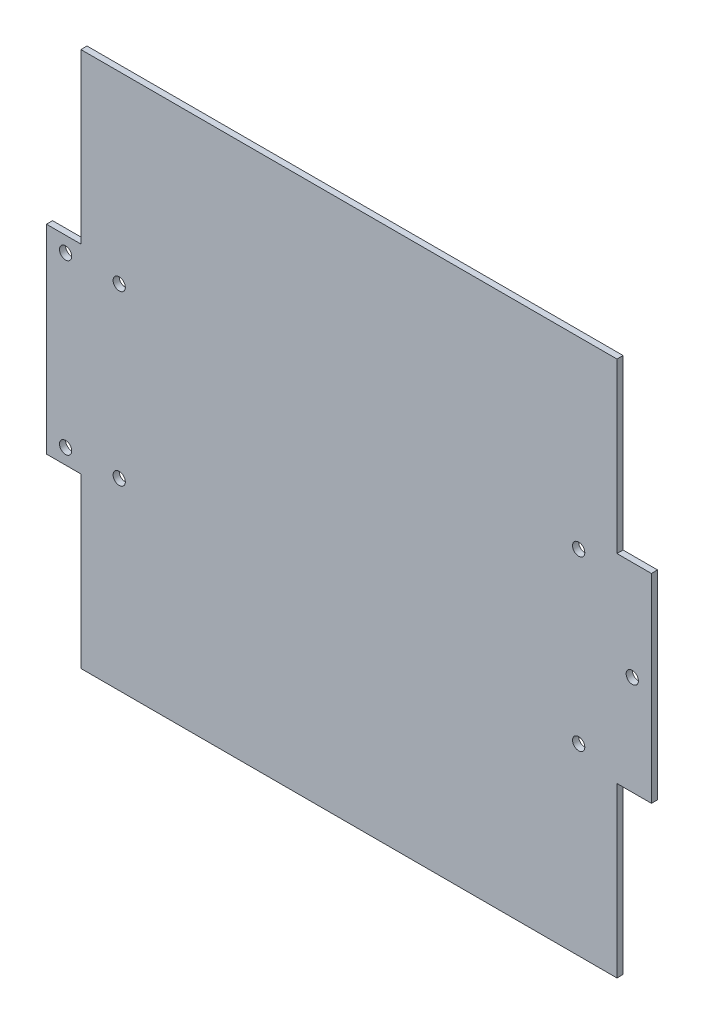
ISO-10303-21;
HEADER;
FILE_DESCRIPTION(('STEP AP214'),'2;1');
FILE_NAME('part.step','',(''),(''),'','','');
FILE_SCHEMA(('AUTOMOTIVE_DESIGN { 1 0 10303 214 1 1 1 1 }'));
ENDSEC;
DATA;
#1=APPLICATION_CONTEXT('core data for automotive mechanical design processes');
#2=APPLICATION_PROTOCOL_DEFINITION('international standard','automotive_design',2000,#1);
#3=PRODUCT_CONTEXT('',#1,'mechanical');
#4=PRODUCT('Part','Part','',(#3));
#5=PRODUCT_RELATED_PRODUCT_CATEGORY('part','',(#4));
#6=PRODUCT_DEFINITION_FORMATION('','',#4);
#7=PRODUCT_DEFINITION_CONTEXT('part definition',#1,'design');
#8=PRODUCT_DEFINITION('design','',#6,#7);
#9=PRODUCT_DEFINITION_SHAPE('','',#8);
#10=(LENGTH_UNIT() NAMED_UNIT(*) SI_UNIT(.MILLI.,.METRE.));
#11=(NAMED_UNIT(*) PLANE_ANGLE_UNIT() SI_UNIT($,.RADIAN.));
#12=(NAMED_UNIT(*) SI_UNIT($,.STERADIAN.) SOLID_ANGLE_UNIT());
#13=UNCERTAINTY_MEASURE_WITH_UNIT(LENGTH_MEASURE(1.E-05),#10,'distance_accuracy_value','');
#14=(GEOMETRIC_REPRESENTATION_CONTEXT(3) GLOBAL_UNCERTAINTY_ASSIGNED_CONTEXT((#13)) GLOBAL_UNIT_ASSIGNED_CONTEXT((#10,
#11,#12)) REPRESENTATION_CONTEXT('',''));
#15=CARTESIAN_POINT('',(0.,0.,0.));
#16=DIRECTION('',(0.,0.,1.));
#17=DIRECTION('',(1.,0.,0.));
#18=AXIS2_PLACEMENT_3D('',#15,#16,#17);
#19=CARTESIAN_POINT('',(0.,0.,1.6));
#20=DIRECTION('',(1.,0.,0.));
#21=DIRECTION('',(0.,1.,0.));
#22=AXIS2_PLACEMENT_3D('',#19,#20,#21);
#23=PLANE('',#22);
#24=DIRECTION('',(0.,-1.,0.));
#25=VECTOR('',#24,1.);
#26=CARTESIAN_POINT('',(0.,0.,0.));
#27=LINE('',#26,#25);
#28=CARTESIAN_POINT('',(0.,44.,0.));
#29=VERTEX_POINT('',#28);
#30=CARTESIAN_POINT('',(0.,0.,0.));
#31=VERTEX_POINT('',#30);
#32=EDGE_CURVE('E152',#29,#31,#27,.T.);
#33=ORIENTED_EDGE('',*,*,#32,.T.);
#34=DIRECTION('',(0.,0.,-1.));
#35=VECTOR('',#34,1.);
#36=CARTESIAN_POINT('',(0.,0.,1.6));
#37=LINE('',#36,#35);
#38=CARTESIAN_POINT('',(0.,0.,1.6));
#39=VERTEX_POINT('',#38);
#40=EDGE_CURVE('E11',#39,#31,#37,.T.);
#41=ORIENTED_EDGE('',*,*,#40,.F.);
#42=DIRECTION('',(0.,-1.,0.));
#43=VECTOR('',#42,1.);
#44=CARTESIAN_POINT('',(0.,0.,1.6));
#45=LINE('',#44,#43);
#46=CARTESIAN_POINT('',(0.,44.,1.6));
#47=VERTEX_POINT('',#46);
#48=EDGE_CURVE('E175',#47,#39,#45,.T.);
#49=ORIENTED_EDGE('',*,*,#48,.F.);
#50=DIRECTION('',(0.,0.,-1.));
#51=VECTOR('',#50,1.);
#52=CARTESIAN_POINT('',(0.,44.,1.6));
#53=LINE('',#52,#51);
#54=EDGE_CURVE('E148',#47,#29,#53,.T.);
#55=ORIENTED_EDGE('',*,*,#54,.T.);
#56=EDGE_LOOP('',(#33,#41,#49,#55));
#57=FACE_BOUND('',#56,.T.);
#58=ADVANCED_FACE('F32',(#57),#23,.F.);
#59=CARTESIAN_POINT('',(0.,0.,1.6));
#60=DIRECTION('',(0.,1.,0.));
#61=DIRECTION('',(-1.,0.,0.));
#62=AXIS2_PLACEMENT_3D('',#59,#60,#61);
#63=PLANE('',#62);
#64=DIRECTION('',(1.,0.,0.));
#65=VECTOR('',#64,1.);
#66=CARTESIAN_POINT('',(0.,0.,0.));
#67=LINE('',#66,#65);
#68=CARTESIAN_POINT('',(140.,0.,0.));
#69=VERTEX_POINT('',#68);
#70=EDGE_CURVE('E155',#31,#69,#67,.T.);
#71=ORIENTED_EDGE('',*,*,#70,.T.);
#72=DIRECTION('',(0.,0.,-1.));
#73=VECTOR('',#72,1.);
#74=CARTESIAN_POINT('',(140.,0.,1.6));
#75=LINE('',#74,#73);
#76=CARTESIAN_POINT('',(140.,0.,1.6));
#77=VERTEX_POINT('',#76);
#78=EDGE_CURVE('E40',#77,#69,#75,.T.);
#79=ORIENTED_EDGE('',*,*,#78,.F.);
#80=DIRECTION('',(1.,0.,0.));
#81=VECTOR('',#80,1.);
#82=CARTESIAN_POINT('',(0.,0.,1.6));
#83=LINE('',#82,#81);
#84=EDGE_CURVE('E103',#39,#77,#83,.T.);
#85=ORIENTED_EDGE('',*,*,#84,.F.);
#86=ORIENTED_EDGE('',*,*,#40,.T.);
#87=EDGE_LOOP('',(#71,#79,#85,#86));
#88=FACE_BOUND('',#87,.T.);
#89=ADVANCED_FACE('F254',(#88),#63,.F.);
#90=CARTESIAN_POINT('',(140.,0.,1.6));
#91=DIRECTION('',(-1.,0.,0.));
#92=DIRECTION('',(0.,0.,1.));
#93=AXIS2_PLACEMENT_3D('',#90,#91,#92);
#94=PLANE('',#93);
#95=DIRECTION('',(0.,1.,0.));
#96=VECTOR('',#95,1.);
#97=CARTESIAN_POINT('',(140.,0.,0.));
#98=LINE('',#97,#96);
#99=CARTESIAN_POINT('',(140.,44.,0.));
#100=VERTEX_POINT('',#99);
#101=EDGE_CURVE('E158',#69,#100,#98,.T.);
#102=ORIENTED_EDGE('',*,*,#101,.T.);
#103=DIRECTION('',(0.,0.,-1.));
#104=VECTOR('',#103,1.);
#105=CARTESIAN_POINT('',(140.,44.,1.6));
#106=LINE('',#105,#104);
#107=CARTESIAN_POINT('',(140.,44.,1.6));
#108=VERTEX_POINT('',#107);
#109=EDGE_CURVE('E194',#108,#100,#106,.T.);
#110=ORIENTED_EDGE('',*,*,#109,.F.);
#111=DIRECTION('',(0.,1.,0.));
#112=VECTOR('',#111,1.);
#113=CARTESIAN_POINT('',(140.,0.,1.6));
#114=LINE('',#113,#112);
#115=EDGE_CURVE('E202',#77,#108,#114,.T.);
#116=ORIENTED_EDGE('',*,*,#115,.F.);
#117=ORIENTED_EDGE('',*,*,#78,.T.);
#118=EDGE_LOOP('',(#102,#110,#116,#117));
#119=FACE_BOUND('',#118,.T.);
#120=ADVANCED_FACE('F200',(#119),#94,.F.);
#121=CARTESIAN_POINT('',(140.,44.,1.6));
#122=DIRECTION('',(0.,1.,0.));
#123=DIRECTION('',(-1.,0.,0.));
#124=AXIS2_PLACEMENT_3D('',#121,#122,#123);
#125=PLANE('',#124);
#126=DIRECTION('',(1.,0.,0.));
#127=VECTOR('',#126,1.);
#128=CARTESIAN_POINT('',(140.,44.,0.));
#129=LINE('',#128,#127);
#130=CARTESIAN_POINT('',(149.,44.,0.));
#131=VERTEX_POINT('',#130);
#132=EDGE_CURVE('E160',#100,#131,#129,.T.);
#133=ORIENTED_EDGE('',*,*,#132,.T.);
#134=DIRECTION('',(0.,0.,-1.));
#135=VECTOR('',#134,1.);
#136=CARTESIAN_POINT('',(149.,44.,1.6));
#137=LINE('',#136,#135);
#138=CARTESIAN_POINT('',(149.,44.,1.6));
#139=VERTEX_POINT('',#138);
#140=EDGE_CURVE('E191',#139,#131,#137,.T.);
#141=ORIENTED_EDGE('',*,*,#140,.F.);
#142=DIRECTION('',(1.,0.,0.));
#143=VECTOR('',#142,1.);
#144=CARTESIAN_POINT('',(140.,44.,1.6));
#145=LINE('',#144,#143);
#146=EDGE_CURVE('E220',#108,#139,#145,.T.);
#147=ORIENTED_EDGE('',*,*,#146,.F.);
#148=ORIENTED_EDGE('',*,*,#109,.T.);
#149=EDGE_LOOP('',(#133,#141,#147,#148));
#150=FACE_BOUND('',#149,.T.);
#151=ADVANCED_FACE('F211',(#150),#125,.F.);
#152=CARTESIAN_POINT('',(149.,44.,1.6));
#153=DIRECTION('',(-1.,0.,0.));
#154=DIRECTION('',(0.,0.,1.));
#155=AXIS2_PLACEMENT_3D('',#152,#153,#154);
#156=PLANE('',#155);
#157=DIRECTION('',(0.,1.,0.));
#158=VECTOR('',#157,1.);
#159=CARTESIAN_POINT('',(149.,44.,0.));
#160=LINE('',#159,#158);
#161=CARTESIAN_POINT('',(149.,96.,0.));
#162=VERTEX_POINT('',#161);
#163=EDGE_CURVE('E162',#131,#162,#160,.T.);
#164=ORIENTED_EDGE('',*,*,#163,.T.);
#165=DIRECTION('',(0.,0.,-1.));
#166=VECTOR('',#165,1.);
#167=CARTESIAN_POINT('',(149.,96.,1.6));
#168=LINE('',#167,#166);
#169=CARTESIAN_POINT('',(149.,96.,1.6));
#170=VERTEX_POINT('',#169);
#171=EDGE_CURVE('E188',#170,#162,#168,.T.);
#172=ORIENTED_EDGE('',*,*,#171,.F.);
#173=DIRECTION('',(0.,1.,0.));
#174=VECTOR('',#173,1.);
#175=CARTESIAN_POINT('',(149.,44.,1.6));
#176=LINE('',#175,#174);
#177=EDGE_CURVE('E217',#139,#170,#176,.T.);
#178=ORIENTED_EDGE('',*,*,#177,.F.);
#179=ORIENTED_EDGE('',*,*,#140,.T.);
#180=EDGE_LOOP('',(#164,#172,#178,#179));
#181=FACE_BOUND('',#180,.T.);
#182=ADVANCED_FACE('F215',(#181),#156,.F.);
#183=CARTESIAN_POINT('',(149.,96.,1.6));
#184=DIRECTION('',(0.,-1.,0.));
#185=DIRECTION('',(0.,0.,-1.));
#186=AXIS2_PLACEMENT_3D('',#183,#184,#185);
#187=PLANE('',#186);
#188=DIRECTION('',(-1.,0.,0.));
#189=VECTOR('',#188,1.);
#190=CARTESIAN_POINT('',(149.,96.,0.));
#191=LINE('',#190,#189);
#192=CARTESIAN_POINT('',(140.,96.,0.));
#193=VERTEX_POINT('',#192);
#194=EDGE_CURVE('E164',#162,#193,#191,.T.);
#195=ORIENTED_EDGE('',*,*,#194,.T.);
#196=DIRECTION('',(0.,0.,-1.));
#197=VECTOR('',#196,1.);
#198=CARTESIAN_POINT('',(140.,96.,1.6));
#199=LINE('',#198,#197);
#200=CARTESIAN_POINT('',(140.,96.,1.6));
#201=VERTEX_POINT('',#200);
#202=EDGE_CURVE('E185',#201,#193,#199,.T.);
#203=ORIENTED_EDGE('',*,*,#202,.F.);
#204=DIRECTION('',(-1.,0.,0.));
#205=VECTOR('',#204,1.);
#206=CARTESIAN_POINT('',(149.,96.,1.6));
#207=LINE('',#206,#205);
#208=EDGE_CURVE('E219',#170,#201,#207,.T.);
#209=ORIENTED_EDGE('',*,*,#208,.F.);
#210=ORIENTED_EDGE('',*,*,#171,.T.);
#211=EDGE_LOOP('',(#195,#203,#209,#210));
#212=FACE_BOUND('',#211,.T.);
#213=ADVANCED_FACE('F267',(#212),#187,.F.);
#214=CARTESIAN_POINT('',(140.,96.,1.6));
#215=DIRECTION('',(-1.,0.,0.));
#216=DIRECTION('',(0.,-1.,0.));
#217=AXIS2_PLACEMENT_3D('',#214,#215,#216);
#218=PLANE('',#217);
#219=DIRECTION('',(0.,1.,0.));
#220=VECTOR('',#219,1.);
#221=CARTESIAN_POINT('',(140.,96.,0.));
#222=LINE('',#221,#220);
#223=CARTESIAN_POINT('',(140.,140.,0.));
#224=VERTEX_POINT('',#223);
#225=EDGE_CURVE('E166',#193,#224,#222,.T.);
#226=ORIENTED_EDGE('',*,*,#225,.T.);
#227=DIRECTION('',(0.,0.,-1.));
#228=VECTOR('',#227,1.);
#229=CARTESIAN_POINT('',(140.,140.,1.6));
#230=LINE('',#229,#228);
#231=CARTESIAN_POINT('',(140.,140.,1.6));
#232=VERTEX_POINT('',#231);
#233=EDGE_CURVE('E182',#232,#224,#230,.T.);
#234=ORIENTED_EDGE('',*,*,#233,.F.);
#235=DIRECTION('',(0.,1.,0.));
#236=VECTOR('',#235,1.);
#237=CARTESIAN_POINT('',(140.,96.,1.6));
#238=LINE('',#237,#236);
#239=EDGE_CURVE('E222',#201,#232,#238,.T.);
#240=ORIENTED_EDGE('',*,*,#239,.F.);
#241=ORIENTED_EDGE('',*,*,#202,.T.);
#242=EDGE_LOOP('',(#226,#234,#240,#241));
#243=FACE_BOUND('',#242,.T.);
#244=ADVANCED_FACE('F270',(#243),#218,.F.);
#245=CARTESIAN_POINT('',(0.,140.,1.6));
#246=DIRECTION('',(0.,-1.,0.));
#247=DIRECTION('',(0.,0.,-1.));
#248=AXIS2_PLACEMENT_3D('',#245,#246,#247);
#249=PLANE('',#248);
#250=DIRECTION('',(-1.,0.,0.));
#251=VECTOR('',#250,1.);
#252=CARTESIAN_POINT('',(0.,140.,0.));
#253=LINE('',#252,#251);
#254=CARTESIAN_POINT('',(0.,140.,0.));
#255=VERTEX_POINT('',#254);
#256=EDGE_CURVE('E168',#224,#255,#253,.T.);
#257=ORIENTED_EDGE('',*,*,#256,.T.);
#258=DIRECTION('',(0.,0.,-1.));
#259=VECTOR('',#258,1.);
#260=CARTESIAN_POINT('',(0.,140.,1.6));
#261=LINE('',#260,#259);
#262=CARTESIAN_POINT('',(0.,140.,1.6));
#263=VERTEX_POINT('',#262);
#264=EDGE_CURVE('E179',#263,#255,#261,.T.);
#265=ORIENTED_EDGE('',*,*,#264,.F.);
#266=DIRECTION('',(-1.,0.,0.));
#267=VECTOR('',#266,1.);
#268=CARTESIAN_POINT('',(0.,140.,1.6));
#269=LINE('',#268,#267);
#270=EDGE_CURVE('E228',#232,#263,#269,.T.);
#271=ORIENTED_EDGE('',*,*,#270,.F.);
#272=ORIENTED_EDGE('',*,*,#233,.T.);
#273=EDGE_LOOP('',(#257,#265,#271,#272));
#274=FACE_BOUND('',#273,.T.);
#275=ADVANCED_FACE('F234',(#274),#249,.F.);
#276=CARTESIAN_POINT('',(0.,96.,1.6));
#277=DIRECTION('',(1.,0.,0.));
#278=DIRECTION('',(0.,0.,-1.));
#279=AXIS2_PLACEMENT_3D('',#276,#277,#278);
#280=PLANE('',#279);
#281=DIRECTION('',(0.,-1.,0.));
#282=VECTOR('',#281,1.);
#283=CARTESIAN_POINT('',(0.,96.,0.));
#284=LINE('',#283,#282);
#285=CARTESIAN_POINT('',(0.,96.,0.));
#286=VERTEX_POINT('',#285);
#287=EDGE_CURVE('E170',#255,#286,#284,.T.);
#288=ORIENTED_EDGE('',*,*,#287,.T.);
#289=DIRECTION('',(0.,0.,-1.));
#290=VECTOR('',#289,1.);
#291=CARTESIAN_POINT('',(0.,96.,1.6));
#292=LINE('',#291,#290);
#293=CARTESIAN_POINT('',(0.,96.,1.6));
#294=VERTEX_POINT('',#293);
#295=EDGE_CURVE('E143',#294,#286,#292,.T.);
#296=ORIENTED_EDGE('',*,*,#295,.F.);
#297=DIRECTION('',(0.,-1.,0.));
#298=VECTOR('',#297,1.);
#299=CARTESIAN_POINT('',(0.,96.,1.6));
#300=LINE('',#299,#298);
#301=EDGE_CURVE('E134',#263,#294,#300,.T.);
#302=ORIENTED_EDGE('',*,*,#301,.F.);
#303=ORIENTED_EDGE('',*,*,#264,.T.);
#304=EDGE_LOOP('',(#288,#296,#302,#303));
#305=FACE_BOUND('',#304,.T.);
#306=ADVANCED_FACE('F238',(#305),#280,.F.);
#307=CARTESIAN_POINT('',(0.,96.,1.6));
#308=DIRECTION('',(0.,-1.,0.));
#309=DIRECTION('',(1.,0.,0.));
#310=AXIS2_PLACEMENT_3D('',#307,#308,#309);
#311=PLANE('',#310);
#312=DIRECTION('',(-1.,0.,0.));
#313=VECTOR('',#312,1.);
#314=CARTESIAN_POINT('',(0.,96.,0.));
#315=LINE('',#314,#313);
#316=CARTESIAN_POINT('',(-9.,96.,0.));
#317=VERTEX_POINT('',#316);
#318=EDGE_CURVE('E142',#286,#317,#315,.T.);
#319=ORIENTED_EDGE('',*,*,#318,.T.);
#320=DIRECTION('',(0.,0.,-1.));
#321=VECTOR('',#320,1.);
#322=CARTESIAN_POINT('',(-9.,96.,1.6));
#323=LINE('',#322,#321);
#324=CARTESIAN_POINT('',(-9.,96.,1.6));
#325=VERTEX_POINT('',#324);
#326=EDGE_CURVE('E139',#325,#317,#323,.T.);
#327=ORIENTED_EDGE('',*,*,#326,.F.);
#328=DIRECTION('',(-1.,0.,0.));
#329=VECTOR('',#328,1.);
#330=CARTESIAN_POINT('',(0.,96.,1.6));
#331=LINE('',#330,#329);
#332=EDGE_CURVE('E128',#294,#325,#331,.T.);
#333=ORIENTED_EDGE('',*,*,#332,.F.);
#334=ORIENTED_EDGE('',*,*,#295,.T.);
#335=EDGE_LOOP('',(#319,#327,#333,#334));
#336=FACE_BOUND('',#335,.T.);
#337=ADVANCED_FACE('F140',(#336),#311,.F.);
#338=CARTESIAN_POINT('',(-9.,96.,1.6));
#339=DIRECTION('',(1.,0.,0.));
#340=DIRECTION('',(0.,1.,0.));
#341=AXIS2_PLACEMENT_3D('',#338,#339,#340);
#342=PLANE('',#341);
#343=DIRECTION('',(0.,-1.,0.));
#344=VECTOR('',#343,1.);
#345=CARTESIAN_POINT('',(-9.,96.,0.));
#346=LINE('',#345,#344);
#347=CARTESIAN_POINT('',(-8.99999999999999,44.,0.));
#348=VERTEX_POINT('',#347);
#349=EDGE_CURVE('E89',#317,#348,#346,.T.);
#350=ORIENTED_EDGE('',*,*,#349,.T.);
#351=DIRECTION('',(0.,0.,-1.));
#352=VECTOR('',#351,1.);
#353=CARTESIAN_POINT('',(-8.99999999999999,44.,1.6));
#354=LINE('',#353,#352);
#355=CARTESIAN_POINT('',(-8.99999999999999,44.,1.6));
#356=VERTEX_POINT('',#355);
#357=EDGE_CURVE('E144',#356,#348,#354,.T.);
#358=ORIENTED_EDGE('',*,*,#357,.F.);
#359=DIRECTION('',(0.,-1.,0.));
#360=VECTOR('',#359,1.);
#361=CARTESIAN_POINT('',(-9.,96.,1.6));
#362=LINE('',#361,#360);
#363=EDGE_CURVE('E132',#325,#356,#362,.T.);
#364=ORIENTED_EDGE('',*,*,#363,.F.);
#365=ORIENTED_EDGE('',*,*,#326,.T.);
#366=EDGE_LOOP('',(#350,#358,#364,#365));
#367=FACE_BOUND('',#366,.T.);
#368=ADVANCED_FACE('F146',(#367),#342,.F.);
#369=CARTESIAN_POINT('',(-8.99999999999999,44.,1.6));
#370=DIRECTION('',(0.,1.,0.));
#371=DIRECTION('',(-1.,0.,0.));
#372=AXIS2_PLACEMENT_3D('',#369,#370,#371);
#373=PLANE('',#372);
#374=DIRECTION('',(1.,0.,0.));
#375=VECTOR('',#374,1.);
#376=CARTESIAN_POINT('',(-8.99999999999999,44.,0.));
#377=LINE('',#376,#375);
#378=EDGE_CURVE('E95',#348,#29,#377,.T.);
#379=ORIENTED_EDGE('',*,*,#378,.T.);
#380=ORIENTED_EDGE('',*,*,#54,.F.);
#381=DIRECTION('',(1.,0.,0.));
#382=VECTOR('',#381,1.);
#383=CARTESIAN_POINT('',(-8.99999999999999,44.,1.6));
#384=LINE('',#383,#382);
#385=EDGE_CURVE('E48',#356,#47,#384,.T.);
#386=ORIENTED_EDGE('',*,*,#385,.F.);
#387=ORIENTED_EDGE('',*,*,#357,.T.);
#388=EDGE_LOOP('',(#379,#380,#386,#387));
#389=FACE_BOUND('',#388,.T.);
#390=ADVANCED_FACE('F242',(#389),#373,.F.);
#391=CARTESIAN_POINT('',(0.,44.,1.6));
#392=DIRECTION('',(0.,0.,-1.));
#393=DIRECTION('',(-1.,0.,0.));
#394=AXIS2_PLACEMENT_3D('',#391,#392,#393);
#395=PLANE('',#394);
#396=CARTESIAN_POINT('',(144.,70.,1.6));
#397=DIRECTION('',(0.,0.,1.));
#398=DIRECTION('',(1.,0.,0.));
#399=AXIS2_PLACEMENT_3D('',#396,#397,#398);
#400=CIRCLE('',#399,1.59999999999999);
#401=CARTESIAN_POINT('',(145.6,70.,1.6));
#402=VERTEX_POINT('',#401);
#403=EDGE_CURVE('E386',#402,#402,#400,.T.);
#404=ORIENTED_EDGE('',*,*,#403,.F.);
#405=EDGE_LOOP('',(#404));
#406=FACE_BOUND('',#405,.T.);
#407=CARTESIAN_POINT('',(-3.99999999999996,48.,1.6));
#408=DIRECTION('',(0.,0.,1.));
#409=DIRECTION('',(1.,0.,0.));
#410=AXIS2_PLACEMENT_3D('',#407,#408,#409);
#411=CIRCLE('',#410,1.6);
#412=CARTESIAN_POINT('',(-2.39999999999997,48.,1.6));
#413=VERTEX_POINT('',#412);
#414=EDGE_CURVE('E388',#413,#413,#411,.T.);
#415=ORIENTED_EDGE('',*,*,#414,.F.);
#416=EDGE_LOOP('',(#415));
#417=FACE_BOUND('',#416,.T.);
#418=CARTESIAN_POINT('',(-3.99999999999997,92.,1.6));
#419=DIRECTION('',(0.,0.,1.));
#420=DIRECTION('',(1.,0.,0.));
#421=AXIS2_PLACEMENT_3D('',#418,#419,#420);
#422=CIRCLE('',#421,1.6);
#423=CARTESIAN_POINT('',(-2.39999999999997,92.,1.6));
#424=VERTEX_POINT('',#423);
#425=EDGE_CURVE('E394',#424,#424,#422,.T.);
#426=ORIENTED_EDGE('',*,*,#425,.F.);
#427=EDGE_LOOP('',(#426));
#428=FACE_BOUND('',#427,.T.);
#429=CARTESIAN_POINT('',(130.,92.,1.6));
#430=DIRECTION('',(0.,0.,-1.));
#431=DIRECTION('',(-1.,0.,0.));
#432=AXIS2_PLACEMENT_3D('',#429,#430,#431);
#433=CIRCLE('',#432,1.59999999999999);
#434=CARTESIAN_POINT('',(128.4,92.,1.6));
#435=VERTEX_POINT('',#434);
#436=EDGE_CURVE('E405',#435,#435,#433,.T.);
#437=ORIENTED_EDGE('',*,*,#436,.T.);
#438=EDGE_LOOP('',(#437));
#439=FACE_BOUND('',#438,.T.);
#440=CARTESIAN_POINT('',(130.,48.,1.6));
#441=DIRECTION('',(0.,0.,-1.));
#442=DIRECTION('',(-1.,0.,0.));
#443=AXIS2_PLACEMENT_3D('',#440,#441,#442);
#444=CIRCLE('',#443,1.59999999999999);
#445=CARTESIAN_POINT('',(128.4,48.,1.6));
#446=VERTEX_POINT('',#445);
#447=EDGE_CURVE('E411',#446,#446,#444,.T.);
#448=ORIENTED_EDGE('',*,*,#447,.T.);
#449=EDGE_LOOP('',(#448));
#450=FACE_BOUND('',#449,.T.);
#451=CARTESIAN_POINT('',(10.,92.,1.6));
#452=DIRECTION('',(0.,0.,-1.));
#453=DIRECTION('',(-1.,0.,0.));
#454=AXIS2_PLACEMENT_3D('',#451,#452,#453);
#455=CIRCLE('',#454,1.6);
#456=CARTESIAN_POINT('',(8.40000000000005,92.,1.6));
#457=VERTEX_POINT('',#456);
#458=EDGE_CURVE('E417',#457,#457,#455,.T.);
#459=ORIENTED_EDGE('',*,*,#458,.T.);
#460=EDGE_LOOP('',(#459));
#461=FACE_BOUND('',#460,.T.);
#462=CARTESIAN_POINT('',(10.,48.,1.6));
#463=DIRECTION('',(0.,0.,-1.));
#464=DIRECTION('',(-1.,0.,0.));
#465=AXIS2_PLACEMENT_3D('',#462,#463,#464);
#466=CIRCLE('',#465,1.6);
#467=CARTESIAN_POINT('',(8.40000000000004,48.,1.6));
#468=VERTEX_POINT('',#467);
#469=EDGE_CURVE('E156',#468,#468,#466,.T.);
#470=ORIENTED_EDGE('',*,*,#469,.T.);
#471=EDGE_LOOP('',(#470));
#472=FACE_BOUND('',#471,.T.);
#473=ORIENTED_EDGE('',*,*,#48,.T.);
#474=ORIENTED_EDGE('',*,*,#84,.T.);
#475=ORIENTED_EDGE('',*,*,#115,.T.);
#476=ORIENTED_EDGE('',*,*,#146,.T.);
#477=ORIENTED_EDGE('',*,*,#177,.T.);
#478=ORIENTED_EDGE('',*,*,#208,.T.);
#479=ORIENTED_EDGE('',*,*,#239,.T.);
#480=ORIENTED_EDGE('',*,*,#270,.T.);
#481=ORIENTED_EDGE('',*,*,#301,.T.);
#482=ORIENTED_EDGE('',*,*,#332,.T.);
#483=ORIENTED_EDGE('',*,*,#363,.T.);
#484=ORIENTED_EDGE('',*,*,#385,.T.);
#485=EDGE_LOOP('',(#473,#474,#475,#476,#477,#478,#479,#480,#481,#482,#483,#484));
#486=FACE_BOUND('',#485,.T.);
#487=ADVANCED_FACE('F130',(#406,#417,#428,#439,#450,#461,#472,#486),#395,.F.);
#488=CARTESIAN_POINT('',(0.,44.,0.));
#489=DIRECTION('',(0.,0.,-1.));
#490=DIRECTION('',(-1.,0.,0.));
#491=AXIS2_PLACEMENT_3D('',#488,#489,#490);
#492=PLANE('',#491);
#493=CARTESIAN_POINT('',(144.,70.,0.));
#494=DIRECTION('',(0.,0.,1.));
#495=DIRECTION('',(1.,0.,0.));
#496=AXIS2_PLACEMENT_3D('',#493,#494,#495);
#497=CIRCLE('',#496,1.59999999999999);
#498=CARTESIAN_POINT('',(145.6,70.,0.));
#499=VERTEX_POINT('',#498);
#500=EDGE_CURVE('E383',#499,#499,#497,.T.);
#501=ORIENTED_EDGE('',*,*,#500,.T.);
#502=EDGE_LOOP('',(#501));
#503=FACE_BOUND('',#502,.T.);
#504=CARTESIAN_POINT('',(-3.99999999999996,48.,0.));
#505=DIRECTION('',(0.,0.,1.));
#506=DIRECTION('',(1.,0.,0.));
#507=AXIS2_PLACEMENT_3D('',#504,#505,#506);
#508=CIRCLE('',#507,1.6);
#509=CARTESIAN_POINT('',(-2.39999999999997,48.,0.));
#510=VERTEX_POINT('',#509);
#511=EDGE_CURVE('E391',#510,#510,#508,.T.);
#512=ORIENTED_EDGE('',*,*,#511,.T.);
#513=EDGE_LOOP('',(#512));
#514=FACE_BOUND('',#513,.T.);
#515=CARTESIAN_POINT('',(-3.99999999999997,92.,0.));
#516=DIRECTION('',(0.,0.,1.));
#517=DIRECTION('',(1.,0.,0.));
#518=AXIS2_PLACEMENT_3D('',#515,#516,#517);
#519=CIRCLE('',#518,1.6);
#520=CARTESIAN_POINT('',(-2.39999999999997,92.,0.));
#521=VERTEX_POINT('',#520);
#522=EDGE_CURVE('E397',#521,#521,#519,.T.);
#523=ORIENTED_EDGE('',*,*,#522,.T.);
#524=EDGE_LOOP('',(#523));
#525=FACE_BOUND('',#524,.T.);
#526=CARTESIAN_POINT('',(130.,92.,0.));
#527=DIRECTION('',(0.,0.,-1.));
#528=DIRECTION('',(-1.,0.,0.));
#529=AXIS2_PLACEMENT_3D('',#526,#527,#528);
#530=CIRCLE('',#529,1.59999999999999);
#531=CARTESIAN_POINT('',(128.4,92.,0.));
#532=VERTEX_POINT('',#531);
#533=EDGE_CURVE('E400',#532,#532,#530,.T.);
#534=ORIENTED_EDGE('',*,*,#533,.F.);
#535=EDGE_LOOP('',(#534));
#536=FACE_BOUND('',#535,.T.);
#537=CARTESIAN_POINT('',(130.,48.,0.));
#538=DIRECTION('',(0.,0.,-1.));
#539=DIRECTION('',(-1.,0.,0.));
#540=AXIS2_PLACEMENT_3D('',#537,#538,#539);
#541=CIRCLE('',#540,1.59999999999999);
#542=CARTESIAN_POINT('',(128.4,48.,0.));
#543=VERTEX_POINT('',#542);
#544=EDGE_CURVE('E408',#543,#543,#541,.T.);
#545=ORIENTED_EDGE('',*,*,#544,.F.);
#546=EDGE_LOOP('',(#545));
#547=FACE_BOUND('',#546,.T.);
#548=CARTESIAN_POINT('',(10.,92.,0.));
#549=DIRECTION('',(0.,0.,-1.));
#550=DIRECTION('',(-1.,0.,0.));
#551=AXIS2_PLACEMENT_3D('',#548,#549,#550);
#552=CIRCLE('',#551,1.6);
#553=CARTESIAN_POINT('',(8.40000000000005,92.,0.));
#554=VERTEX_POINT('',#553);
#555=EDGE_CURVE('E414',#554,#554,#552,.T.);
#556=ORIENTED_EDGE('',*,*,#555,.F.);
#557=EDGE_LOOP('',(#556));
#558=FACE_BOUND('',#557,.T.);
#559=CARTESIAN_POINT('',(10.,48.,0.));
#560=DIRECTION('',(0.,0.,-1.));
#561=DIRECTION('',(-1.,0.,0.));
#562=AXIS2_PLACEMENT_3D('',#559,#560,#561);
#563=CIRCLE('',#562,1.6);
#564=CARTESIAN_POINT('',(8.40000000000004,48.,0.));
#565=VERTEX_POINT('',#564);
#566=EDGE_CURVE('E420',#565,#565,#563,.T.);
#567=ORIENTED_EDGE('',*,*,#566,.F.);
#568=EDGE_LOOP('',(#567));
#569=FACE_BOUND('',#568,.T.);
#570=ORIENTED_EDGE('',*,*,#32,.F.);
#571=ORIENTED_EDGE('',*,*,#378,.F.);
#572=ORIENTED_EDGE('',*,*,#349,.F.);
#573=ORIENTED_EDGE('',*,*,#318,.F.);
#574=ORIENTED_EDGE('',*,*,#287,.F.);
#575=ORIENTED_EDGE('',*,*,#256,.F.);
#576=ORIENTED_EDGE('',*,*,#225,.F.);
#577=ORIENTED_EDGE('',*,*,#194,.F.);
#578=ORIENTED_EDGE('',*,*,#163,.F.);
#579=ORIENTED_EDGE('',*,*,#132,.F.);
#580=ORIENTED_EDGE('',*,*,#101,.F.);
#581=ORIENTED_EDGE('',*,*,#70,.F.);
#582=EDGE_LOOP('',(#570,#571,#572,#573,#574,#575,#576,#577,#578,#579,#580,#581));
#583=FACE_BOUND('',#582,.T.);
#584=ADVANCED_FACE('F206',(#503,#514,#525,#536,#547,#558,#569,#583),#492,.T.);
#585=CARTESIAN_POINT('',(10.,48.,0.));
#586=DIRECTION('',(0.,0.,-1.));
#587=DIRECTION('',(-1.,0.,0.));
#588=AXIS2_PLACEMENT_3D('',#585,#586,#587);
#589=CYLINDRICAL_SURFACE('',#588,1.6);
#590=ORIENTED_EDGE('',*,*,#566,.T.);
#591=EDGE_LOOP('',(#590));
#592=FACE_BOUND('',#591,.T.);
#593=ORIENTED_EDGE('',*,*,#469,.F.);
#594=EDGE_LOOP('',(#593));
#595=FACE_BOUND('',#594,.T.);
#596=ADVANCED_FACE('F298',(#592,#595),#589,.F.);
#597=CARTESIAN_POINT('',(10.,92.,0.));
#598=DIRECTION('',(0.,0.,-1.));
#599=DIRECTION('',(-1.,0.,0.));
#600=AXIS2_PLACEMENT_3D('',#597,#598,#599);
#601=CYLINDRICAL_SURFACE('',#600,1.6);
#602=ORIENTED_EDGE('',*,*,#555,.T.);
#603=EDGE_LOOP('',(#602));
#604=FACE_BOUND('',#603,.T.);
#605=ORIENTED_EDGE('',*,*,#458,.F.);
#606=EDGE_LOOP('',(#605));
#607=FACE_BOUND('',#606,.T.);
#608=ADVANCED_FACE('F303',(#604,#607),#601,.F.);
#609=CARTESIAN_POINT('',(130.,48.,0.));
#610=DIRECTION('',(0.,0.,-1.));
#611=DIRECTION('',(-1.,0.,0.));
#612=AXIS2_PLACEMENT_3D('',#609,#610,#611);
#613=CYLINDRICAL_SURFACE('',#612,1.59999999999999);
#614=ORIENTED_EDGE('',*,*,#544,.T.);
#615=EDGE_LOOP('',(#614));
#616=FACE_BOUND('',#615,.T.);
#617=ORIENTED_EDGE('',*,*,#447,.F.);
#618=EDGE_LOOP('',(#617));
#619=FACE_BOUND('',#618,.T.);
#620=ADVANCED_FACE('F315',(#616,#619),#613,.F.);
#621=CARTESIAN_POINT('',(130.,92.,0.));
#622=DIRECTION('',(0.,0.,-1.));
#623=DIRECTION('',(-1.,0.,0.));
#624=AXIS2_PLACEMENT_3D('',#621,#622,#623);
#625=CYLINDRICAL_SURFACE('',#624,1.59999999999999);
#626=ORIENTED_EDGE('',*,*,#533,.T.);
#627=EDGE_LOOP('',(#626));
#628=FACE_BOUND('',#627,.T.);
#629=ORIENTED_EDGE('',*,*,#436,.F.);
#630=EDGE_LOOP('',(#629));
#631=FACE_BOUND('',#630,.T.);
#632=ADVANCED_FACE('F325',(#628,#631),#625,.F.);
#633=CARTESIAN_POINT('',(-3.99999999999997,92.,0.));
#634=DIRECTION('',(0.,0.,1.));
#635=DIRECTION('',(1.,0.,0.));
#636=AXIS2_PLACEMENT_3D('',#633,#634,#635);
#637=CYLINDRICAL_SURFACE('',#636,1.6);
#638=ORIENTED_EDGE('',*,*,#522,.F.);
#639=EDGE_LOOP('',(#638));
#640=FACE_BOUND('',#639,.T.);
#641=ORIENTED_EDGE('',*,*,#425,.T.);
#642=EDGE_LOOP('',(#641));
#643=FACE_BOUND('',#642,.T.);
#644=ADVANCED_FACE('F335',(#640,#643),#637,.F.);
#645=CARTESIAN_POINT('',(-3.99999999999996,48.,0.));
#646=DIRECTION('',(0.,0.,1.));
#647=DIRECTION('',(1.,0.,0.));
#648=AXIS2_PLACEMENT_3D('',#645,#646,#647);
#649=CYLINDRICAL_SURFACE('',#648,1.6);
#650=ORIENTED_EDGE('',*,*,#511,.F.);
#651=EDGE_LOOP('',(#650));
#652=FACE_BOUND('',#651,.T.);
#653=ORIENTED_EDGE('',*,*,#414,.T.);
#654=EDGE_LOOP('',(#653));
#655=FACE_BOUND('',#654,.T.);
#656=ADVANCED_FACE('F356',(#652,#655),#649,.F.);
#657=CARTESIAN_POINT('',(144.,70.,0.));
#658=DIRECTION('',(0.,0.,1.));
#659=DIRECTION('',(1.,0.,0.));
#660=AXIS2_PLACEMENT_3D('',#657,#658,#659);
#661=CYLINDRICAL_SURFACE('',#660,1.59999999999999);
#662=ORIENTED_EDGE('',*,*,#500,.F.);
#663=EDGE_LOOP('',(#662));
#664=FACE_BOUND('',#663,.T.);
#665=ORIENTED_EDGE('',*,*,#403,.T.);
#666=EDGE_LOOP('',(#665));
#667=FACE_BOUND('',#666,.T.);
#668=ADVANCED_FACE('F366',(#664,#667),#661,.F.);
#669=CLOSED_SHELL('',(#58,#89,#120,#151,#182,#213,#244,#275,#306,#337,#368,#390,#487,#584,#596,
#608,#620,#632,#644,#656,#668));
#670=MANIFOLD_SOLID_BREP('B2',#669);
#671=ADVANCED_BREP_SHAPE_REPRESENTATION('',(#18,#670),#14);
#672=SHAPE_DEFINITION_REPRESENTATION(#9,#671);
ENDSEC;
END-ISO-10303-21;
